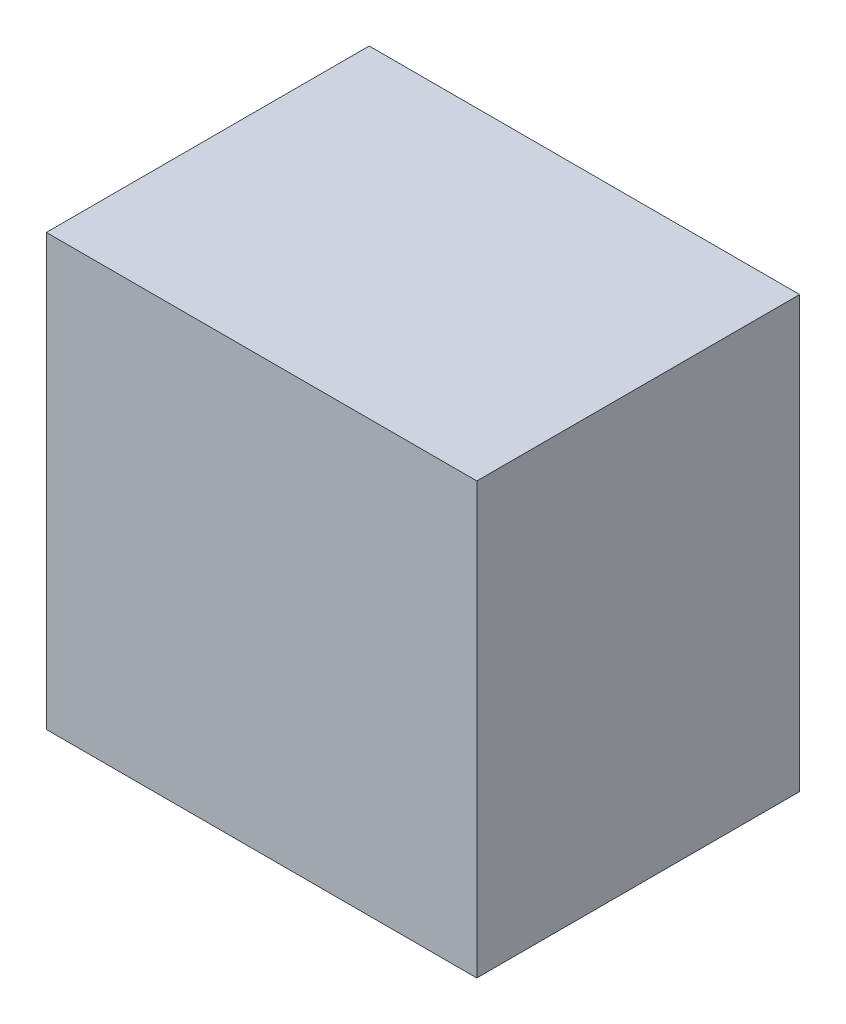
ISO-10303-21;
HEADER;
FILE_DESCRIPTION(('STEP AP214'),'2;1');
FILE_NAME('part.step','',(''),(''),'','','');
FILE_SCHEMA(('AUTOMOTIVE_DESIGN { 1 0 10303 214 1 1 1 1 }'));
ENDSEC;
DATA;
#1=APPLICATION_CONTEXT('core data for automotive mechanical design processes');
#2=APPLICATION_PROTOCOL_DEFINITION('international standard','automotive_design',2000,#1);
#3=PRODUCT_CONTEXT('',#1,'mechanical');
#4=PRODUCT('Part','Part','',(#3));
#5=PRODUCT_RELATED_PRODUCT_CATEGORY('part','',(#4));
#6=PRODUCT_DEFINITION_FORMATION('','',#4);
#7=PRODUCT_DEFINITION_CONTEXT('part definition',#1,'design');
#8=PRODUCT_DEFINITION('design','',#6,#7);
#9=PRODUCT_DEFINITION_SHAPE('','',#8);
#10=(LENGTH_UNIT() NAMED_UNIT(*) SI_UNIT(.MILLI.,.METRE.));
#11=(NAMED_UNIT(*) PLANE_ANGLE_UNIT() SI_UNIT($,.RADIAN.));
#12=(NAMED_UNIT(*) SI_UNIT($,.STERADIAN.) SOLID_ANGLE_UNIT());
#13=UNCERTAINTY_MEASURE_WITH_UNIT(LENGTH_MEASURE(1.E-05),#10,'distance_accuracy_value','');
#14=(GEOMETRIC_REPRESENTATION_CONTEXT(3) GLOBAL_UNCERTAINTY_ASSIGNED_CONTEXT((#13)) GLOBAL_UNIT_ASSIGNED_CONTEXT((#10,
#11,#12)) REPRESENTATION_CONTEXT('',''));
#15=CARTESIAN_POINT('',(0.,0.,0.));
#16=DIRECTION('',(0.,0.,1.));
#17=DIRECTION('',(1.,0.,0.));
#18=AXIS2_PLACEMENT_3D('',#15,#16,#17);
#19=CARTESIAN_POINT('',(726.,1539.,-752.));
#20=DIRECTION('',(-1.,0.,0.));
#21=DIRECTION('',(0.,0.,1.));
#22=AXIS2_PLACEMENT_3D('',#19,#20,#21);
#23=PLANE('',#22);
#24=DIRECTION('',(0.,-1.,0.));
#25=VECTOR('',#24,1.);
#26=CARTESIAN_POINT('',(726.,1539.,-740.));
#27=LINE('',#26,#25);
#28=CARTESIAN_POINT('',(726.,1555.,-740.));
#29=VERTEX_POINT('',#28);
#30=CARTESIAN_POINT('',(726.,1539.,-740.));
#31=VERTEX_POINT('',#30);
#32=EDGE_CURVE('E103',#29,#31,#27,.T.);
#33=ORIENTED_EDGE('',*,*,#32,.F.);
#34=DIRECTION('',(0.,0.,1.));
#35=VECTOR('',#34,1.);
#36=CARTESIAN_POINT('',(726.,1555.,-752.));
#37=LINE('',#36,#35);
#38=CARTESIAN_POINT('',(726.,1555.,-752.));
#39=VERTEX_POINT('',#38);
#40=EDGE_CURVE('E11',#39,#29,#37,.T.);
#41=ORIENTED_EDGE('',*,*,#40,.F.);
#42=DIRECTION('',(0.,-1.,0.));
#43=VECTOR('',#42,1.);
#44=CARTESIAN_POINT('',(726.,1539.,-752.));
#45=LINE('',#44,#43);
#46=CARTESIAN_POINT('',(726.,1539.,-752.));
#47=VERTEX_POINT('',#46);
#48=EDGE_CURVE('E97',#39,#47,#45,.T.);
#49=ORIENTED_EDGE('',*,*,#48,.T.);
#50=DIRECTION('',(0.,0.,1.));
#51=VECTOR('',#50,1.);
#52=CARTESIAN_POINT('',(726.,1539.,-752.));
#53=LINE('',#52,#51);
#54=EDGE_CURVE('E42',#47,#31,#53,.T.);
#55=ORIENTED_EDGE('',*,*,#54,.T.);
#56=EDGE_LOOP('',(#33,#41,#49,#55));
#57=FACE_BOUND('',#56,.T.);
#58=ADVANCED_FACE('F39',(#57),#23,.T.);
#59=CARTESIAN_POINT('',(726.,1555.,-752.));
#60=DIRECTION('',(0.,1.,0.));
#61=DIRECTION('',(0.,0.,1.));
#62=AXIS2_PLACEMENT_3D('',#59,#60,#61);
#63=PLANE('',#62);
#64=DIRECTION('',(-1.,0.,0.));
#65=VECTOR('',#64,1.);
#66=CARTESIAN_POINT('',(726.,1555.,-740.));
#67=LINE('',#66,#65);
#68=CARTESIAN_POINT('',(742.,1555.,-740.));
#69=VERTEX_POINT('',#68);
#70=EDGE_CURVE('E99',#69,#29,#67,.T.);
#71=ORIENTED_EDGE('',*,*,#70,.F.);
#72=DIRECTION('',(0.,0.,1.));
#73=VECTOR('',#72,1.);
#74=CARTESIAN_POINT('',(742.,1555.,-752.));
#75=LINE('',#74,#73);
#76=CARTESIAN_POINT('',(742.,1555.,-752.));
#77=VERTEX_POINT('',#76);
#78=EDGE_CURVE('E48',#77,#69,#75,.T.);
#79=ORIENTED_EDGE('',*,*,#78,.F.);
#80=DIRECTION('',(-1.,0.,0.));
#81=VECTOR('',#80,1.);
#82=CARTESIAN_POINT('',(726.,1555.,-752.));
#83=LINE('',#82,#81);
#84=EDGE_CURVE('E94',#77,#39,#83,.T.);
#85=ORIENTED_EDGE('',*,*,#84,.T.);
#86=ORIENTED_EDGE('',*,*,#40,.T.);
#87=EDGE_LOOP('',(#71,#79,#85,#86));
#88=FACE_BOUND('',#87,.T.);
#89=ADVANCED_FACE('F113',(#88),#63,.T.);
#90=CARTESIAN_POINT('',(742.,1539.,-752.));
#91=DIRECTION('',(1.,0.,0.));
#92=DIRECTION('',(0.,0.,-1.));
#93=AXIS2_PLACEMENT_3D('',#90,#91,#92);
#94=PLANE('',#93);
#95=DIRECTION('',(0.,1.,0.));
#96=VECTOR('',#95,1.);
#97=CARTESIAN_POINT('',(742.,1539.,-740.));
#98=LINE('',#97,#96);
#99=CARTESIAN_POINT('',(742.,1539.,-740.));
#100=VERTEX_POINT('',#99);
#101=EDGE_CURVE('E89',#100,#69,#98,.T.);
#102=ORIENTED_EDGE('',*,*,#101,.F.);
#103=DIRECTION('',(0.,0.,1.));
#104=VECTOR('',#103,1.);
#105=CARTESIAN_POINT('',(742.,1539.,-752.));
#106=LINE('',#105,#104);
#107=CARTESIAN_POINT('',(742.,1539.,-752.));
#108=VERTEX_POINT('',#107);
#109=EDGE_CURVE('E84',#108,#100,#106,.T.);
#110=ORIENTED_EDGE('',*,*,#109,.F.);
#111=DIRECTION('',(0.,1.,0.));
#112=VECTOR('',#111,1.);
#113=CARTESIAN_POINT('',(742.,1539.,-752.));
#114=LINE('',#113,#112);
#115=EDGE_CURVE('E87',#108,#77,#114,.T.);
#116=ORIENTED_EDGE('',*,*,#115,.T.);
#117=ORIENTED_EDGE('',*,*,#78,.T.);
#118=EDGE_LOOP('',(#102,#110,#116,#117));
#119=FACE_BOUND('',#118,.T.);
#120=ADVANCED_FACE('F86',(#119),#94,.T.);
#121=CARTESIAN_POINT('',(726.,1539.,-752.));
#122=DIRECTION('',(0.,-1.,0.));
#123=DIRECTION('',(0.,0.,-1.));
#124=AXIS2_PLACEMENT_3D('',#121,#122,#123);
#125=PLANE('',#124);
#126=DIRECTION('',(1.,0.,0.));
#127=VECTOR('',#126,1.);
#128=CARTESIAN_POINT('',(726.,1539.,-740.));
#129=LINE('',#128,#127);
#130=EDGE_CURVE('E106',#31,#100,#129,.T.);
#131=ORIENTED_EDGE('',*,*,#130,.F.);
#132=ORIENTED_EDGE('',*,*,#54,.F.);
#133=DIRECTION('',(1.,0.,0.));
#134=VECTOR('',#133,1.);
#135=CARTESIAN_POINT('',(726.,1539.,-752.));
#136=LINE('',#135,#134);
#137=EDGE_CURVE('E93',#47,#108,#136,.T.);
#138=ORIENTED_EDGE('',*,*,#137,.T.);
#139=ORIENTED_EDGE('',*,*,#109,.T.);
#140=EDGE_LOOP('',(#131,#132,#138,#139));
#141=FACE_BOUND('',#140,.T.);
#142=ADVANCED_FACE('F96',(#141),#125,.T.);
#143=CARTESIAN_POINT('',(0.,0.,-752.));
#144=DIRECTION('',(0.,0.,-1.));
#145=DIRECTION('',(-1.,0.,0.));
#146=AXIS2_PLACEMENT_3D('',#143,#144,#145);
#147=PLANE('',#146);
#148=ORIENTED_EDGE('',*,*,#48,.F.);
#149=ORIENTED_EDGE('',*,*,#84,.F.);
#150=ORIENTED_EDGE('',*,*,#115,.F.);
#151=ORIENTED_EDGE('',*,*,#137,.F.);
#152=EDGE_LOOP('',(#148,#149,#150,#151));
#153=FACE_BOUND('',#152,.T.);
#154=ADVANCED_FACE('F92',(#153),#147,.T.);
#155=CARTESIAN_POINT('',(0.,0.,-740.));
#156=DIRECTION('',(0.,0.,-1.));
#157=DIRECTION('',(-1.,0.,0.));
#158=AXIS2_PLACEMENT_3D('',#155,#156,#157);
#159=PLANE('',#158);
#160=ORIENTED_EDGE('',*,*,#32,.T.);
#161=ORIENTED_EDGE('',*,*,#130,.T.);
#162=ORIENTED_EDGE('',*,*,#101,.T.);
#163=ORIENTED_EDGE('',*,*,#70,.T.);
#164=EDGE_LOOP('',(#160,#161,#162,#163));
#165=FACE_BOUND('',#164,.T.);
#166=ADVANCED_FACE('F112',(#165),#159,.F.);
#167=CLOSED_SHELL('',(#58,#89,#120,#142,#154,#166));
#168=MANIFOLD_SOLID_BREP('B2',#167);
#169=ADVANCED_BREP_SHAPE_REPRESENTATION('',(#18,#168),#14);
#170=SHAPE_DEFINITION_REPRESENTATION(#9,#169);
ENDSEC;
END-ISO-10303-21;
